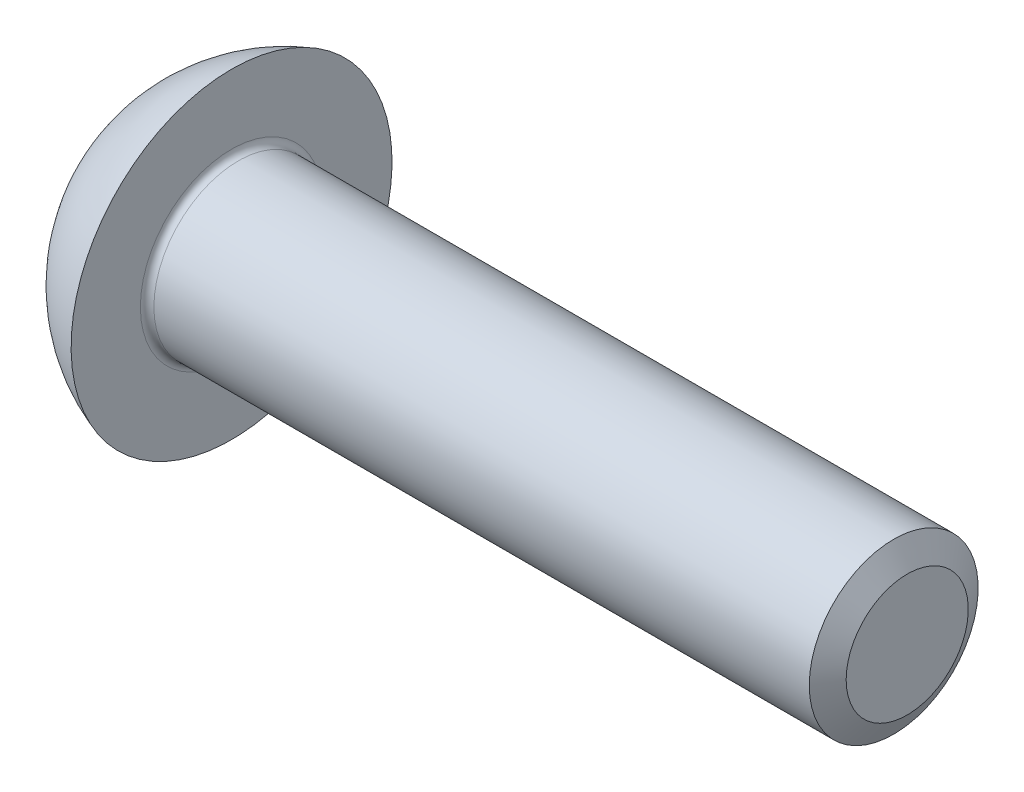
ISO-10303-21;
HEADER;
FILE_DESCRIPTION(('STEP AP214'),'2;1');
FILE_NAME('part.step','',(''),(''),'','','');
FILE_SCHEMA(('AUTOMOTIVE_DESIGN { 1 0 10303 214 1 1 1 1 }'));
ENDSEC;
DATA;
#1=APPLICATION_CONTEXT('core data for automotive mechanical design processes');
#2=APPLICATION_PROTOCOL_DEFINITION('international standard','automotive_design',2000,#1);
#3=PRODUCT_CONTEXT('',#1,'mechanical');
#4=PRODUCT('Part','Part','',(#3));
#5=PRODUCT_RELATED_PRODUCT_CATEGORY('part','',(#4));
#6=PRODUCT_DEFINITION_FORMATION('','',#4);
#7=PRODUCT_DEFINITION_CONTEXT('part definition',#1,'design');
#8=PRODUCT_DEFINITION('design','',#6,#7);
#9=PRODUCT_DEFINITION_SHAPE('','',#8);
#10=(LENGTH_UNIT() NAMED_UNIT(*) SI_UNIT(.MILLI.,.METRE.));
#11=(NAMED_UNIT(*) PLANE_ANGLE_UNIT() SI_UNIT($,.RADIAN.));
#12=(NAMED_UNIT(*) SI_UNIT($,.STERADIAN.) SOLID_ANGLE_UNIT());
#13=UNCERTAINTY_MEASURE_WITH_UNIT(LENGTH_MEASURE(1.E-05),#10,'distance_accuracy_value','');
#14=(GEOMETRIC_REPRESENTATION_CONTEXT(3) GLOBAL_UNCERTAINTY_ASSIGNED_CONTEXT((#13)) GLOBAL_UNIT_ASSIGNED_CONTEXT((#10,
#11,#12)) REPRESENTATION_CONTEXT('',''));
#15=CARTESIAN_POINT('',(0.,0.,0.));
#16=DIRECTION('',(0.,0.,1.));
#17=DIRECTION('',(1.,0.,0.));
#18=AXIS2_PLACEMENT_3D('',#15,#16,#17);
#19=CARTESIAN_POINT('',(-22.75,0.,0.));
#20=DIRECTION('',(-1.,0.,0.));
#21=DIRECTION('',(0.,0.,1.));
#22=AXIS2_PLACEMENT_3D('',#19,#20,#21);
#23=CYLINDRICAL_SURFACE('',#22,2.5);
#24=CARTESIAN_POINT('',(-19.8,0.,0.));
#25=DIRECTION('',(-1.,0.,0.));
#26=DIRECTION('',(0.,0.,1.));
#27=AXIS2_PLACEMENT_3D('',#24,#25,#26);
#28=CIRCLE('',#27,2.5);
#29=CARTESIAN_POINT('',(-19.8,0.,2.5));
#30=VERTEX_POINT('',#29);
#31=EDGE_CURVE('E258',#30,#30,#28,.T.);
#32=ORIENTED_EDGE('',*,*,#31,.F.);
#33=EDGE_LOOP('',(#32));
#34=FACE_BOUND('',#33,.T.);
#35=CARTESIAN_POINT('',(-0.4,0.,0.));
#36=DIRECTION('',(-1.,0.,0.));
#37=DIRECTION('',(0.,0.,1.));
#38=AXIS2_PLACEMENT_3D('',#35,#36,#37);
#39=CIRCLE('',#38,2.5);
#40=CARTESIAN_POINT('',(-0.4,0.,2.5));
#41=VERTEX_POINT('',#40);
#42=EDGE_CURVE('E445',#41,#41,#39,.T.);
#43=ORIENTED_EDGE('',*,*,#42,.T.);
#44=EDGE_LOOP('',(#43));
#45=FACE_BOUND('',#44,.T.);
#46=ADVANCED_FACE('F37',(#34,#45),#23,.T.);
#47=CARTESIAN_POINT('',(-22.75,0.,0.));
#48=DIRECTION('',(1.,0.,0.));
#49=DIRECTION('',(0.,0.,-1.));
#50=AXIS2_PLACEMENT_3D('',#47,#48,#49);
#51=PLANE('',#50);
#52=CARTESIAN_POINT('',(-22.75,0.,0.));
#53=DIRECTION('',(-1.,0.,0.));
#54=DIRECTION('',(0.,0.,1.));
#55=AXIS2_PLACEMENT_3D('',#52,#53,#54);
#56=CIRCLE('',#55,2.5);
#57=CARTESIAN_POINT('',(-22.75,2.5,0.));
#58=VERTEX_POINT('',#57);
#59=EDGE_CURVE('E250',#58,#58,#56,.T.);
#60=ORIENTED_EDGE('',*,*,#59,.T.);
#61=EDGE_LOOP('',(#60));
#62=FACE_BOUND('',#61,.T.);
#63=CARTESIAN_POINT('',(-22.75,0.,0.));
#64=DIRECTION('',(1.,0.,0.));
#65=DIRECTION('',(0.,0.,-1.));
#66=AXIS2_PLACEMENT_3D('',#63,#64,#65);
#67=CIRCLE('',#66,1.73205080756888);
#68=CARTESIAN_POINT('',(-22.75,-0.866025403784439,-1.5));
#69=VERTEX_POINT('',#68);
#70=CARTESIAN_POINT('',(-22.75,-1.73205080756888,0.));
#71=VERTEX_POINT('',#70);
#72=EDGE_CURVE('E11',#69,#71,#67,.F.);
#73=ORIENTED_EDGE('',*,*,#72,.F.);
#74=CARTESIAN_POINT('',(-22.75,0.866025403784439,-1.5));
#75=VERTEX_POINT('',#74);
#76=EDGE_CURVE('E41',#75,#69,#67,.F.);
#77=ORIENTED_EDGE('',*,*,#76,.F.);
#78=CARTESIAN_POINT('',(-22.75,1.73205080756888,0.));
#79=VERTEX_POINT('',#78);
#80=EDGE_CURVE('E110',#79,#75,#67,.F.);
#81=ORIENTED_EDGE('',*,*,#80,.F.);
#82=CARTESIAN_POINT('',(-22.75,0.866025403784438,1.5));
#83=VERTEX_POINT('',#82);
#84=EDGE_CURVE('E323',#83,#79,#67,.F.);
#85=ORIENTED_EDGE('',*,*,#84,.F.);
#86=CARTESIAN_POINT('',(-22.75,-0.866025403784438,1.5));
#87=VERTEX_POINT('',#86);
#88=EDGE_CURVE('E46',#87,#83,#67,.F.);
#89=ORIENTED_EDGE('',*,*,#88,.F.);
#90=CARTESIAN_POINT('',(-22.75,0.,0.));
#91=DIRECTION('',(-1.,0.,0.));
#92=DIRECTION('',(0.,-1.,0.));
#93=AXIS2_PLACEMENT_3D('',#90,#91,#92);
#94=CIRCLE('',#93,1.73205080756888);
#95=EDGE_CURVE('E113',#71,#87,#94,.T.);
#96=ORIENTED_EDGE('',*,*,#95,.F.);
#97=EDGE_LOOP('',(#73,#77,#81,#85,#89,#96));
#98=FACE_BOUND('',#97,.T.);
#99=ADVANCED_FACE('F39',(#62,#98),#51,.F.);
#100=CARTESIAN_POINT('',(-18.4090909090909,0.,0.));
#101=DIRECTION('',(-1.,0.,0.));
#102=DIRECTION('',(0.,1.,0.));
#103=AXIS2_PLACEMENT_3D('',#100,#101,#102);
#104=SPHERICAL_SURFACE('',#103,5.00934044915468);
#105=CARTESIAN_POINT('',(-20.,0.,0.));
#106=DIRECTION('',(-1.,0.,0.));
#107=DIRECTION('',(0.,0.,1.));
#108=AXIS2_PLACEMENT_3D('',#105,#106,#107);
#109=CIRCLE('',#108,4.75);
#110=CARTESIAN_POINT('',(-20.,4.75,0.));
#111=VERTEX_POINT('',#110);
#112=EDGE_CURVE('E253',#111,#111,#109,.T.);
#113=CARTESIAN_POINT('',(-22.75,2.5,0.));
#114=CARTESIAN_POINT('',(-22.7311175552492,2.53278694875913,0.));
#115=CARTESIAN_POINT('',(-22.7118635180392,2.56535988781073,0.));
#116=CARTESIAN_POINT('',(-22.6726224406993,2.6300612032684,0.));
#117=CARTESIAN_POINT('',(-22.6526354005692,2.66218957967448,0.));
#118=CARTESIAN_POINT('',(-22.6119384993871,2.72598522661067,0.));
#119=CARTESIAN_POINT('',(-22.591228638335,2.75765249714078,0.));
#120=CARTESIAN_POINT('',(-22.5490967492469,2.82050968698786,0.));
#121=CARTESIAN_POINT('',(-22.5276747212109,2.85169960630483,0.));
#122=CARTESIAN_POINT('',(-22.4841294907069,2.91358607707779,0.));
#123=CARTESIAN_POINT('',(-22.4620062882389,2.94428262853379,0.));
#124=CARTESIAN_POINT('',(-22.4170700686518,3.00516660462735,0.));
#125=CARTESIAN_POINT('',(-22.3942570515327,3.03535402926492,0.));
#126=CARTESIAN_POINT('',(-22.3479529146413,3.09520425297794,0.));
#127=CARTESIAN_POINT('',(-22.3244617948691,3.12486705205339,0.));
#128=CARTESIAN_POINT('',(-22.2768135133334,3.1836527955612,0.));
#129=CARTESIAN_POINT('',(-22.2526563515699,3.21277573999356,0.));
#130=CARTESIAN_POINT('',(-22.2036883885261,3.27046682221599,0.));
#131=CARTESIAN_POINT('',(-22.1788775872458,3.29903496000605,0.));
#132=CARTESIAN_POINT('',(-22.1286150832646,3.35560176180999,0.));
#133=CARTESIAN_POINT('',(-22.1031633805637,3.38360042582388,0.));
#134=CARTESIAN_POINT('',(-22.0516321408722,3.43901390530852,0.));
#135=CARTESIAN_POINT('',(-22.0255526038815,3.46642872077927,0.));
#136=CARTESIAN_POINT('',(-21.9727790850795,3.52066042816535,0.));
#137=CARTESIAN_POINT('',(-21.9460851032681,3.54747732008068,0.));
#138=CARTESIAN_POINT('',(-21.8920963997549,3.60049941232258,0.));
#139=CARTESIAN_POINT('',(-21.8648016780529,3.62670461264913,0.));
#140=CARTESIAN_POINT('',(-21.8096255081138,3.67848986772817,0.));
#141=CARTESIAN_POINT('',(-21.7817440598766,3.70406992248065,0.));
#142=CARTESIAN_POINT('',(-21.7254087514531,3.75459175338155,0.));
#143=CARTESIAN_POINT('',(-21.6969548912667,3.77953352952998,0.));
#144=CARTESIAN_POINT('',(-21.6394893674124,3.82876599789079,0.));
#145=CARTESIAN_POINT('',(-21.6104777037444,3.85305669010317,0.));
#146=CARTESIAN_POINT('',(-21.5519114677755,3.90097451953224,0.));
#147=CARTESIAN_POINT('',(-21.5223568954747,3.92460165674892,0.));
#148=CARTESIAN_POINT('',(-21.4627200158231,3.97118024580204,0.));
#149=CARTESIAN_POINT('',(-21.4326377084724,3.99413169763847,0.));
#150=CARTESIAN_POINT('',(-21.371960803248,4.03934713244946,0.));
#151=CARTESIAN_POINT('',(-21.3413662053744,4.06161111542403,0.));
#152=CARTESIAN_POINT('',(-21.2796804266456,4.10544018198238,0.));
#153=CARTESIAN_POINT('',(-21.2485892457905,4.12700526556617,0.));
#154=CARTESIAN_POINT('',(-21.1859262635903,4.16942546163525,0.));
#155=CARTESIAN_POINT('',(-21.1543544622453,4.19028057412053,0.));
#156=CARTESIAN_POINT('',(-21.090746448312,4.2312701207906,0.));
#157=CARTESIAN_POINT('',(-21.0587102357238,4.25140455497539,0.));
#158=CARTESIAN_POINT('',(-20.9941898469831,4.29094240784443,0.));
#159=CARTESIAN_POINT('',(-20.9617056708307,4.31034582652867,0.));
#160=CARTESIAN_POINT('',(-20.8963060326305,4.34841168650943,0.));
#161=CARTESIAN_POINT('',(-20.8633905705828,4.36707412780594,0.));
#162=CARTESIAN_POINT('',(-20.7971452596828,4.4036484515375,0.));
#163=CARTESIAN_POINT('',(-20.7638154108306,4.42156033397254,0.));
#164=CARTESIAN_POINT('',(-20.6967584381773,4.45662434389216,0.));
#165=CARTESIAN_POINT('',(-20.6630313143761,4.47377647137673,0.));
#166=CARTESIAN_POINT('',(-20.5951971075898,4.50731216521815,0.));
#167=CARTESIAN_POINT('',(-20.5610900246047,4.52369573157501,0.));
#168=CARTESIAN_POINT('',(-20.4925134104957,4.55568589214188,0.));
#169=CARTESIAN_POINT('',(-20.4580438793719,4.5712924863519,0.));
#170=CARTESIAN_POINT('',(-20.3887600653461,4.601720688376,0.));
#171=CARTESIAN_POINT('',(-20.3539457824442,4.61654229619008,0.));
#172=CARTESIAN_POINT('',(-20.2839903410915,4.64539292215819,0.));
#173=CARTESIAN_POINT('',(-20.2488491826407,4.65942194031222,0.));
#174=CARTESIAN_POINT('',(-20.1782580235286,4.68668016088954,0.));
#175=CARTESIAN_POINT('',(-20.1428080228672,4.69990936331284,0.));
#176=CARTESIAN_POINT('',(-20.0716174112126,4.72556124794158,0.));
#177=CARTESIAN_POINT('',(-20.0358768002195,4.73798393014703,0.));
#178=CARTESIAN_POINT('',(-20.,4.75,0.));
#179=B_SPLINE_CURVE_WITH_KNOTS('',3,(#113,#114,#115,#116,#117,#118,#119,#120,#121,#122,#123,
#124,#125,#126,#127,#128,#129,#130,#131,#132,#133,#134,#135,#136,#137,#138,#139,#140,#141,#142,
#143,#144,#145,#146,#147,#148,#149,#150,#151,#152,#153,#154,#155,#156,#157,#158,#159,#160,#161,
#162,#163,#164,#165,#166,#167,#168,#169,#170,#171,#172,#173,#174,#175,#176,#177,#178),
.UNSPECIFIED.,.F.,.F.,(4,2,2,2,2,2,2,2,2,2,2,2,2,2,2,2,2,2,2,2,2,2,2,2,2,2,2,2,2,2,2,2,4),(0.,
0.11350429129235,0.2270085825847,0.340512873877048,0.454017165169399,0.567521456461748,
0.681025747754096,0.794530039046447,0.908034330338794,1.02153862163114,1.13504291292349,
1.24854720421584,1.36205149550819,1.47555578680054,1.58906007809289,1.70256436938524,
1.81606866067759,1.92957295196994,2.04307724326229,2.15658153455464,2.27008582584699,
2.38359011713934,2.49709440843168,2.61059869972403,2.72410299101638,2.83760728230873,
2.95111157360108,3.06461586489343,3.17812015618578,3.29162444747813,3.40512873877048,
3.51863303006283,3.63213732135518),.UNSPECIFIED.);
#180=EDGE_CURVE('BSEAM239',#58,#111,#179,.T.);
#181=ORIENTED_EDGE('',*,*,#59,.F.);
#182=ORIENTED_EDGE('',*,*,#112,.T.);
#183=ORIENTED_EDGE('',*,*,#180,.T.);
#184=ORIENTED_EDGE('',*,*,#180,.F.);
#185=EDGE_LOOP('',(#181,#183,#182,#184));
#186=FACE_BOUND('',#185,.T.);
#187=ADVANCED_FACE('F239',(#186),#104,.T.);
#188=CARTESIAN_POINT('',(-20.,2.7,0.));
#189=DIRECTION('',(-1.,0.,0.));
#190=DIRECTION('',(0.,0.,1.));
#191=AXIS2_PLACEMENT_3D('',#188,#189,#190);
#192=PLANE('',#191);
#193=ORIENTED_EDGE('',*,*,#112,.F.);
#194=EDGE_LOOP('',(#193));
#195=FACE_BOUND('',#194,.T.);
#196=CARTESIAN_POINT('',(-20.,0.,0.));
#197=DIRECTION('',(-1.,0.,0.));
#198=DIRECTION('',(0.,0.,1.));
#199=AXIS2_PLACEMENT_3D('',#196,#197,#198);
#200=CIRCLE('',#199,2.7);
#201=CARTESIAN_POINT('',(-20.,0.,2.7));
#202=VERTEX_POINT('',#201);
#203=EDGE_CURVE('E254',#202,#202,#200,.T.);
#204=ORIENTED_EDGE('',*,*,#203,.T.);
#205=EDGE_LOOP('',(#204));
#206=FACE_BOUND('',#205,.T.);
#207=ADVANCED_FACE('F236',(#195,#206),#192,.F.);
#208=CARTESIAN_POINT('',(-19.8,0.,0.));
#209=DIRECTION('',(-1.,0.,0.));
#210=DIRECTION('',(0.,0.,1.));
#211=AXIS2_PLACEMENT_3D('',#208,#209,#210);
#212=TOROIDAL_SURFACE('',#211,2.7,0.199999999999998);
#213=ORIENTED_EDGE('',*,*,#203,.F.);
#214=EDGE_LOOP('',(#213));
#215=FACE_BOUND('',#214,.T.);
#216=ORIENTED_EDGE('',*,*,#31,.T.);
#217=EDGE_LOOP('',(#216));
#218=FACE_BOUND('',#217,.T.);
#219=ADVANCED_FACE('F233',(#215,#218),#212,.F.);
#220=CARTESIAN_POINT('',(-22.31,0.,0.));
#221=DIRECTION('',(-1.,0.,0.));
#222=DIRECTION('',(0.,-1.,0.));
#223=AXIS2_PLACEMENT_3D('',#220,#221,#222);
#224=CONICAL_SURFACE('',#223,0.,1.32202446504011);
#225=CARTESIAN_POINT('',(-22.9997327986404,-2.26315484172187,-1.5));
#226=CARTESIAN_POINT('',(-22.9853857350657,-2.19538826304415,-1.5));
#227=CARTESIAN_POINT('',(-22.9712220195062,-2.12758283804671,-1.5));
#228=CARTESIAN_POINT('',(-22.9433537036584,-1.99187493960313,-1.5));
#229=CARTESIAN_POINT('',(-22.9296491220636,-1.92397246232262,-1.5));
#230=CARTESIAN_POINT('',(-22.8893400794674,-1.71997534200334,-1.5));
#231=CARTESIAN_POINT('',(-22.8635667005034,-1.58371395303,-1.5));
#232=CARTESIAN_POINT('',(-22.8155779533991,-1.3116391722774,-1.5));
#233=CARTESIAN_POINT('',(-22.7933366422251,-1.17583044881344,-1.5));
#234=CARTESIAN_POINT('',(-22.7539239714673,-0.903481186888281,-1.5));
#235=CARTESIAN_POINT('',(-22.7367516962328,-0.766940785137058,-1.5));
#236=CARTESIAN_POINT('',(-22.709706129123,-0.491701196322739,-1.5));
#237=CARTESIAN_POINT('',(-22.6999076664801,-0.352994084625562,-1.5));
#238=CARTESIAN_POINT('',(-22.6924178089428,-0.144706433475353,-1.5));
#239=CARTESIAN_POINT('',(-22.6911221806896,-0.0752488922868268,-1.5));
#240=CARTESIAN_POINT('',(-22.6909858523407,0.0636686770369285,-1.5));
#241=CARTESIAN_POINT('',(-22.6921451546032,0.133128705174482,-1.5));
#242=CARTESIAN_POINT('',(-22.6992549405331,0.341881937640922,-1.5));
#243=CARTESIAN_POINT('',(-22.7088546722717,0.481057921169191,-1.5));
#244=CARTESIAN_POINT('',(-22.7357583960435,0.758693846093776,-1.5));
#245=CARTESIAN_POINT('',(-22.7530672903777,0.89715327506259,-1.5));
#246=CARTESIAN_POINT('',(-22.7932968062946,1.17595805857205,-1.5));
#247=CARTESIAN_POINT('',(-22.8163192995755,1.31628822780093,-1.5));
#248=CARTESIAN_POINT('',(-22.8658765091574,1.59633374824371,-1.5));
#249=CARTESIAN_POINT('',(-22.8924117291953,1.73604900830285,-1.5));
#250=CARTESIAN_POINT('',(-22.9477673387906,2.01506024311157,-1.5));
#251=CARTESIAN_POINT('',(-22.9765883427125,2.15435609462068,-1.5));
#252=CARTESIAN_POINT('',(-23.0357503424025,2.43262525968748,-1.5));
#253=CARTESIAN_POINT('',(-23.0660913684414,2.57159856676409,-1.5));
#254=CARTESIAN_POINT('',(-23.1274868354949,2.84781730595656,-1.5));
#255=CARTESIAN_POINT('',(-23.1585300832571,2.9850652362243,-1.5));
#256=CARTESIAN_POINT('',(-23.2213470846916,3.25939633410717,-1.5));
#257=CARTESIAN_POINT('',(-23.2531208531965,3.39647949831729,-1.5));
#258=CARTESIAN_POINT('',(-23.3171602523357,3.67034628769396,-1.5));
#259=CARTESIAN_POINT('',(-23.3494252041408,3.80713007192236,-1.5));
#260=CARTESIAN_POINT('',(-23.4143613419051,4.08059651515644,-1.5));
#261=CARTESIAN_POINT('',(-23.4470325145344,4.21727917732529,-1.5));
#262=CARTESIAN_POINT('',(-23.4798452974435,4.35392744466994,-1.5));
#263=B_SPLINE_CURVE_WITH_KNOTS('',3,(#225,#226,#227,#228,#229,#230,#231,#232,#233,#234,#235,
#236,#237,#238,#239,#240,#241,#242,#243,#244,#245,#246,#247,#248,#249,#250,#251,#252,#253,#254,
#255,#256,#257,#258,#259,#260,#261,#262),.UNSPECIFIED.,.F.,.F.,(4,2,2,2,2,2,2,2,2,2,2,2,2,2,2,2,
2,2,4),(0.,0.207805451429304,0.415619353325522,0.831624344388975,1.24441629689243,
1.65713363858961,2.07398475112845,2.2823533704914,2.49072219003518,2.90892839515078,
3.32740092054575,3.75395104515455,4.18056240487915,4.60728881874959,5.03402373410525,
5.45616570257761,5.87831624988613,6.29992851638619,6.72152698404949),.UNSPECIFIED.);
#264=EDGE_CURVE('E101',#69,#75,#263,.T.);
#265=ORIENTED_EDGE('',*,*,#264,.T.);
#266=ORIENTED_EDGE('',*,*,#76,.T.);
#267=EDGE_LOOP('',(#265,#266));
#268=FACE_BOUND('',#267,.T.);
#269=ADVANCED_FACE('F105',(#268),#224,.F.);
#270=CARTESIAN_POINT('',(-22.7500293362665,0.865909933730601,-1.5002));
#271=CARTESIAN_POINT('',(-22.74088246153,0.901895428599615,-1.43787129455136));
#272=CARTESIAN_POINT('',(-22.7325805371761,0.937939683086652,-1.37544081445887));
#273=CARTESIAN_POINT('',(-22.7179971360444,1.01014267536443,-1.25038156337525));
#274=CARTESIAN_POINT('',(-22.7117163935223,1.04630144995174,-1.18775272865061));
#275=CARTESIAN_POINT('',(-22.7015367196182,1.11853617159982,-1.06263852068553));
#276=CARTESIAN_POINT('',(-22.6976268615435,1.15461172337414,-1.00015383210133));
#277=CARTESIAN_POINT('',(-22.6923843134507,1.22680422415262,-0.875112752827542));
#278=CARTESIAN_POINT('',(-22.6910511776652,1.26292116491464,-0.812556376413771));
#279=CARTESIAN_POINT('',(-22.6910511776652,1.33515504643868,-0.687443623586229));
#280=CARTESIAN_POINT('',(-22.6923843134507,1.37127198720069,-0.624887247172458));
#281=CARTESIAN_POINT('',(-22.6976268615435,1.44346448797918,-0.499846167898674));
#282=CARTESIAN_POINT('',(-22.7015367196182,1.47954003975349,-0.437361479314472));
#283=CARTESIAN_POINT('',(-22.7117163935223,1.55177476140158,-0.312247271349392));
#284=CARTESIAN_POINT('',(-22.7179971360444,1.58793353598888,-0.249618436624752));
#285=CARTESIAN_POINT('',(-22.7325805371761,1.66013652826666,-0.124559185541132));
#286=CARTESIAN_POINT('',(-22.74088246153,1.6961807827537,-0.0621287054486423));
#287=CARTESIAN_POINT('',(-22.7500293362665,1.73216627762271,0.000199999999999426));
#288=B_SPLINE_CURVE_WITH_KNOTS('',3,(#270,#271,#272,#273,#274,#275,#276,#277,#278,#279,#280,
#281,#282,#283,#284,#285,#286,#287),.UNSPECIFIED.,.F.,.F.,(4,2,2,2,2,2,2,2,4),(0.,
0.217659888175594,0.435398758882079,0.652126354970008,0.868816454295957,1.08550655362191,
1.30223414970984,1.51997302041632,1.73763290859191),.UNSPECIFIED.);
#289=EDGE_CURVE('E129',#75,#79,#288,.T.);
#290=ORIENTED_EDGE('',*,*,#289,.T.);
#291=ORIENTED_EDGE('',*,*,#80,.T.);
#292=EDGE_LOOP('',(#290,#291));
#293=FACE_BOUND('',#292,.T.);
#294=ADVANCED_FACE('F157',(#293),#224,.F.);
#295=CARTESIAN_POINT('',(-22.7500293362665,1.73216627762271,-0.000200000000000225));
#296=CARTESIAN_POINT('',(-22.74088246153,1.6961807827537,0.0621287054486416));
#297=CARTESIAN_POINT('',(-22.7325805371761,1.66013652826666,0.124559185541131));
#298=CARTESIAN_POINT('',(-22.7179971360444,1.58793353598888,0.249618436624751));
#299=CARTESIAN_POINT('',(-22.7117163935223,1.55177476140158,0.312247271349392));
#300=CARTESIAN_POINT('',(-22.7015367196182,1.47954003975349,0.437361479314471));
#301=CARTESIAN_POINT('',(-22.6976268615435,1.44346448797918,0.499846167898673));
#302=CARTESIAN_POINT('',(-22.6923843134507,1.37127198720069,0.624887247172458));
#303=CARTESIAN_POINT('',(-22.6910511776652,1.33515504643868,0.687443623586229));
#304=CARTESIAN_POINT('',(-22.6910511776652,1.26292116491464,0.81255637641377));
#305=CARTESIAN_POINT('',(-22.6923843134507,1.22680422415262,0.875112752827541));
#306=CARTESIAN_POINT('',(-22.6976268615435,1.15461172337414,1.00015383210133));
#307=CARTESIAN_POINT('',(-22.7015367196182,1.11853617159982,1.06263852068553));
#308=CARTESIAN_POINT('',(-22.7117163935223,1.04630144995174,1.18775272865061));
#309=CARTESIAN_POINT('',(-22.7179971360444,1.01014267536443,1.25038156337525));
#310=CARTESIAN_POINT('',(-22.7325805371761,0.937939683086651,1.37544081445887));
#311=CARTESIAN_POINT('',(-22.74088246153,0.901895428599615,1.43787129455136));
#312=CARTESIAN_POINT('',(-22.7500293362665,0.865909933730601,1.5002));
#313=B_SPLINE_CURVE_WITH_KNOTS('',3,(#295,#296,#297,#298,#299,#300,#301,#302,#303,#304,#305,
#306,#307,#308,#309,#310,#311,#312),.UNSPECIFIED.,.F.,.F.,(4,2,2,2,2,2,2,2,4),(0.,
0.217659888175594,0.435398758882078,0.652126354970008,0.868816454295957,1.08550655362191,
1.30223414970984,1.51997302041632,1.73763290859191),.UNSPECIFIED.);
#314=EDGE_CURVE('E179',#79,#83,#313,.T.);
#315=ORIENTED_EDGE('',*,*,#314,.T.);
#316=ORIENTED_EDGE('',*,*,#84,.T.);
#317=EDGE_LOOP('',(#315,#316));
#318=FACE_BOUND('',#317,.T.);
#319=ADVANCED_FACE('F151',(#318),#224,.F.);
#320=CARTESIAN_POINT('',(-22.9997327986404,-2.26315484172187,1.5));
#321=CARTESIAN_POINT('',(-22.9853857350657,-2.19538826304415,1.5));
#322=CARTESIAN_POINT('',(-22.9712220195062,-2.12758283804671,1.5));
#323=CARTESIAN_POINT('',(-22.9433537036584,-1.99187493960313,1.5));
#324=CARTESIAN_POINT('',(-22.9296491220636,-1.92397246232262,1.5));
#325=CARTESIAN_POINT('',(-22.8893400794674,-1.71997534200334,1.5));
#326=CARTESIAN_POINT('',(-22.8635667005034,-1.58371395303,1.5));
#327=CARTESIAN_POINT('',(-22.8155779533991,-1.3116391722774,1.5));
#328=CARTESIAN_POINT('',(-22.7933366422251,-1.17583044881344,1.5));
#329=CARTESIAN_POINT('',(-22.7539239714673,-0.903481186888281,1.5));
#330=CARTESIAN_POINT('',(-22.7367516962328,-0.766940785137059,1.5));
#331=CARTESIAN_POINT('',(-22.709706129123,-0.49170119632274,1.5));
#332=CARTESIAN_POINT('',(-22.6999076664801,-0.352994084625563,1.5));
#333=CARTESIAN_POINT('',(-22.6924178089428,-0.144706433475354,1.5));
#334=CARTESIAN_POINT('',(-22.6911221806896,-0.0752488922868278,1.5));
#335=CARTESIAN_POINT('',(-22.6909858523407,0.0636686770369274,1.5));
#336=CARTESIAN_POINT('',(-22.6921451546032,0.133128705174481,1.5));
#337=CARTESIAN_POINT('',(-22.6992549405331,0.341881937640921,1.5));
#338=CARTESIAN_POINT('',(-22.7088546722717,0.48105792116919,1.5));
#339=CARTESIAN_POINT('',(-22.7357583960435,0.758693846093775,1.5));
#340=CARTESIAN_POINT('',(-22.7530672903777,0.89715327506259,1.5));
#341=CARTESIAN_POINT('',(-22.7932968062946,1.17595805857205,1.5));
#342=CARTESIAN_POINT('',(-22.8163192995755,1.31628822780093,1.5));
#343=CARTESIAN_POINT('',(-22.8658765091574,1.59633374824371,1.5));
#344=CARTESIAN_POINT('',(-22.8924117291953,1.73604900830285,1.5));
#345=CARTESIAN_POINT('',(-22.9477673387906,2.01506024311157,1.5));
#346=CARTESIAN_POINT('',(-22.9765883427125,2.15435609462068,1.5));
#347=CARTESIAN_POINT('',(-23.0357503424025,2.43262525968747,1.5));
#348=CARTESIAN_POINT('',(-23.0660913684414,2.57159856676409,1.5));
#349=CARTESIAN_POINT('',(-23.1274868354949,2.84781730595656,1.5));
#350=CARTESIAN_POINT('',(-23.1585300832572,2.9850652362243,1.5));
#351=CARTESIAN_POINT('',(-23.2213470846916,3.25939633410717,1.5));
#352=CARTESIAN_POINT('',(-23.2531208531965,3.39647949831729,1.5));
#353=CARTESIAN_POINT('',(-23.3171602523357,3.67034628769396,1.5));
#354=CARTESIAN_POINT('',(-23.3494252041408,3.80713007192236,1.5));
#355=CARTESIAN_POINT('',(-23.4143613419051,4.08059651515644,1.5));
#356=CARTESIAN_POINT('',(-23.4470325145344,4.21727917732529,1.5));
#357=CARTESIAN_POINT('',(-23.4798452974435,4.35392744466993,1.5));
#358=B_SPLINE_CURVE_WITH_KNOTS('',3,(#320,#321,#322,#323,#324,#325,#326,#327,#328,#329,#330,
#331,#332,#333,#334,#335,#336,#337,#338,#339,#340,#341,#342,#343,#344,#345,#346,#347,#348,#349,
#350,#351,#352,#353,#354,#355,#356,#357),.UNSPECIFIED.,.F.,.F.,(4,2,2,2,2,2,2,2,2,2,2,2,2,2,2,2,
2,2,4),(0.,0.207805451429304,0.415619353325522,0.831624344388974,1.24441629689243,
1.65713363858961,2.07398475112845,2.2823533704914,2.49072219003518,2.90892839515078,
3.32740092054575,3.75395104515455,4.18056240487915,4.60728881874959,5.03402373410525,
5.4561657025776,5.87831624988613,6.29992851638619,6.72152698404949),.UNSPECIFIED.);
#359=EDGE_CURVE('E58',#83,#87,#358,.F.);
#360=ORIENTED_EDGE('',*,*,#359,.T.);
#361=ORIENTED_EDGE('',*,*,#88,.T.);
#362=EDGE_LOOP('',(#360,#361));
#363=FACE_BOUND('',#362,.T.);
#364=ADVANCED_FACE('F156',(#363),#224,.F.);
#365=CARTESIAN_POINT('',(-22.7500293362665,-0.865909933730602,1.5002));
#366=CARTESIAN_POINT('',(-22.74088246153,-0.901895428599616,1.43787129455136));
#367=CARTESIAN_POINT('',(-22.7325805371761,-0.937939683086652,1.37544081445887));
#368=CARTESIAN_POINT('',(-22.7179971360444,-1.01014267536443,1.25038156337525));
#369=CARTESIAN_POINT('',(-22.7117163935223,-1.04630144995174,1.18775272865061));
#370=CARTESIAN_POINT('',(-22.7015367196182,-1.11853617159982,1.06263852068553));
#371=CARTESIAN_POINT('',(-22.6976268615435,-1.15461172337414,1.00015383210133));
#372=CARTESIAN_POINT('',(-22.6923843134507,-1.22680422415262,0.875112752827541));
#373=CARTESIAN_POINT('',(-22.6910511776652,-1.26292116491464,0.81255637641377));
#374=CARTESIAN_POINT('',(-22.6910511776652,-1.33515504643868,0.687443623586229));
#375=CARTESIAN_POINT('',(-22.6923843134507,-1.3712719872007,0.624887247172458));
#376=CARTESIAN_POINT('',(-22.6976268615435,-1.44346448797918,0.499846167898673));
#377=CARTESIAN_POINT('',(-22.7015367196182,-1.4795400397535,0.437361479314471));
#378=CARTESIAN_POINT('',(-22.7117163935223,-1.55177476140158,0.312247271349391));
#379=CARTESIAN_POINT('',(-22.7179971360444,-1.58793353598888,0.249618436624751));
#380=CARTESIAN_POINT('',(-22.7325805371761,-1.66013652826667,0.12455918554113));
#381=CARTESIAN_POINT('',(-22.74088246153,-1.6961807827537,0.0621287054486408));
#382=CARTESIAN_POINT('',(-22.7500293362665,-1.73216627762272,-0.000200000000000785));
#383=B_SPLINE_CURVE_WITH_KNOTS('',3,(#365,#366,#367,#368,#369,#370,#371,#372,#373,#374,#375,
#376,#377,#378,#379,#380,#381,#382),.UNSPECIFIED.,.F.,.F.,(4,2,2,2,2,2,2,2,4),(0.,
0.217659888175594,0.435398758882079,0.652126354970009,0.868816454295957,1.08550655362191,
1.30223414970984,1.51997302041632,1.73763290859191),.UNSPECIFIED.);
#384=EDGE_CURVE('E52',#87,#71,#383,.T.);
#385=ORIENTED_EDGE('',*,*,#384,.T.);
#386=ORIENTED_EDGE('',*,*,#95,.T.);
#387=EDGE_LOOP('',(#385,#386));
#388=FACE_BOUND('',#387,.T.);
#389=ADVANCED_FACE('F310',(#388),#224,.F.);
#390=CARTESIAN_POINT('',(-22.7500293362665,-1.73216627762272,0.00019999999999925));
#391=CARTESIAN_POINT('',(-22.74088246153,-1.6961807827537,-0.0621287054486427));
#392=CARTESIAN_POINT('',(-22.7325805371761,-1.66013652826667,-0.124559185541132));
#393=CARTESIAN_POINT('',(-22.7179971360444,-1.58793353598888,-0.249618436624752));
#394=CARTESIAN_POINT('',(-22.7117163935223,-1.55177476140158,-0.312247271349392));
#395=CARTESIAN_POINT('',(-22.7015367196182,-1.4795400397535,-0.437361479314472));
#396=CARTESIAN_POINT('',(-22.6976268615435,-1.44346448797918,-0.499846167898674));
#397=CARTESIAN_POINT('',(-22.6923843134507,-1.3712719872007,-0.624887247172459));
#398=CARTESIAN_POINT('',(-22.6910511776652,-1.33515504643868,-0.687443623586229));
#399=CARTESIAN_POINT('',(-22.6910511776652,-1.26292116491464,-0.812556376413771));
#400=CARTESIAN_POINT('',(-22.6923843134507,-1.22680422415262,-0.875112752827542));
#401=CARTESIAN_POINT('',(-22.6976268615435,-1.15461172337414,-1.00015383210133));
#402=CARTESIAN_POINT('',(-22.7015367196182,-1.11853617159982,-1.06263852068553));
#403=CARTESIAN_POINT('',(-22.7117163935223,-1.04630144995174,-1.18775272865061));
#404=CARTESIAN_POINT('',(-22.7179971360444,-1.01014267536443,-1.25038156337525));
#405=CARTESIAN_POINT('',(-22.7325805371761,-0.937939683086652,-1.37544081445887));
#406=CARTESIAN_POINT('',(-22.74088246153,-0.901895428599616,-1.43787129455136));
#407=CARTESIAN_POINT('',(-22.7500293362665,-0.865909933730602,-1.5002));
#408=B_SPLINE_CURVE_WITH_KNOTS('',3,(#390,#391,#392,#393,#394,#395,#396,#397,#398,#399,#400,
#401,#402,#403,#404,#405,#406,#407),.UNSPECIFIED.,.F.,.F.,(4,2,2,2,2,2,2,2,4),(0.,
0.217659888175594,0.435398758882078,0.652126354970008,0.868816454295957,1.08550655362191,
1.30223414970984,1.51997302041632,1.73763290859191),.UNSPECIFIED.);
#409=EDGE_CURVE('E93',#71,#69,#408,.T.);
#410=ORIENTED_EDGE('',*,*,#409,.T.);
#411=ORIENTED_EDGE('',*,*,#72,.T.);
#412=EDGE_LOOP('',(#410,#411));
#413=FACE_BOUND('',#412,.T.);
#414=ADVANCED_FACE('F95',(#413),#224,.F.);
#415=CARTESIAN_POINT('',(-21.19,0.,0.));
#416=DIRECTION('',(-1.,0.,0.));
#417=DIRECTION('',(0.,0.,1.));
#418=AXIS2_PLACEMENT_3D('',#415,#416,#417);
#419=CONICAL_SURFACE('',#418,1.73205080756888,0.968816775195701);
#420=CARTESIAN_POINT('',(-20.,0.,0.));
#421=VERTEX_POINT('',#420);
#422=VERTEX_LOOP('',#421);
#423=FACE_BOUND('',#422,.T.);
#424=CARTESIAN_POINT('',(-21.7143652871569,-1.99408064313991,1.5));
#425=CARTESIAN_POINT('',(-21.684227855331,-1.93917647330948,1.5));
#426=CARTESIAN_POINT('',(-21.6544233144778,-1.88408663074089,1.5));
#427=CARTESIAN_POINT('',(-21.5956475088077,-1.77344983083036,1.5));
#428=CARTESIAN_POINT('',(-21.5666764212646,-1.71790277942533,1.5));
#429=CARTESIAN_POINT('',(-21.509567028683,-1.60593431975272,1.5));
#430=CARTESIAN_POINT('',(-21.4814351847783,-1.54950959844382,1.5));
#431=CARTESIAN_POINT('',(-21.4264488202439,-1.43604611919069,1.5));
#432=CARTESIAN_POINT('',(-21.399594226521,-1.37900739661351,1.5));
#433=CARTESIAN_POINT('',(-21.3197775837943,-1.2033156155846,1.5));
#434=CARTESIAN_POINT('',(-21.2693416399369,-1.08349045754164,1.5));
#435=CARTESIAN_POINT('',(-21.1790949619613,-0.840058194478799,1.5));
#436=CARTESIAN_POINT('',(-21.139256444983,-0.716461944664996,1.5));
#437=CARTESIAN_POINT('',(-21.0902439408571,-0.521743313216657,1.5));
#438=CARTESIAN_POINT('',(-21.0753421174822,-0.452079932693849,1.5));
#439=CARTESIAN_POINT('',(-21.0515518141556,-0.311717383105092,1.5));
#440=CARTESIAN_POINT('',(-21.0426622801891,-0.241018397812502,1.5));
#441=CARTESIAN_POINT('',(-21.0317604291189,-0.100110996787739,1.5));
#442=CARTESIAN_POINT('',(-21.0296501098018,-0.0299103680159279,1.5));
#443=CARTESIAN_POINT('',(-21.0322315011996,0.110369362468128,1.5));
#444=CARTESIAN_POINT('',(-21.0369241805432,0.180448445451889,1.5));
#445=CARTESIAN_POINT('',(-21.0544804827323,0.335771456747225,1.5));
#446=CARTESIAN_POINT('',(-21.0689629761538,0.42083042497674,1.5));
#447=CARTESIAN_POINT('',(-21.1058580296261,0.589196026048483,1.5));
#448=CARTESIAN_POINT('',(-21.1282753745263,0.672501569361895,1.5));
#449=CARTESIAN_POINT('',(-21.1797644805511,0.839227656420883,1.5));
#450=CARTESIAN_POINT('',(-21.208985606932,0.922601164698551,1.5));
#451=CARTESIAN_POINT('',(-21.2562928043733,1.04629218365327,1.5));
#452=CARTESIAN_POINT('',(-21.272640267702,1.0872924127348,1.5));
#453=CARTESIAN_POINT('',(-21.3063320836918,1.16888024651752,1.5));
#454=CARTESIAN_POINT('',(-21.3236763971299,1.20946786737972,1.5));
#455=CARTESIAN_POINT('',(-21.3779952738762,1.33298038355505,1.5));
#456=CARTESIAN_POINT('',(-21.4163386174147,1.41530297926867,1.5));
#457=CARTESIAN_POINT('',(-21.495635756582,1.57868674687711,1.5));
#458=CARTESIAN_POINT('',(-21.5365900776787,1.65974766074443,1.5));
#459=CARTESIAN_POINT('',(-21.6204609314907,1.82090931341637,1.5));
#460=CARTESIAN_POINT('',(-21.6633786931538,1.90100941012621,1.5));
#461=CARTESIAN_POINT('',(-21.7506848855457,2.06040592965211,1.5));
#462=CARTESIAN_POINT('',(-21.7950733934288,2.13970231002002,1.5));
#463=CARTESIAN_POINT('',(-21.930164519251,2.37707005979971,1.5));
#464=CARTESIAN_POINT('',(-22.0225574046205,2.53417780353515,1.5));
#465=CARTESIAN_POINT('',(-22.2100828976953,2.84665345203122,1.5));
#466=CARTESIAN_POINT('',(-22.3052144606998,3.00202198962762,1.5));
#467=CARTESIAN_POINT('',(-22.4847567141849,3.29134301760585,1.5));
#468=CARTESIAN_POINT('',(-22.5689406054582,3.42543652219581,1.5));
#469=CARTESIAN_POINT('',(-22.7383361071422,3.69299221027437,1.5));
#470=CARTESIAN_POINT('',(-22.8235478291718,3.82645432296446,1.5));
#471=CARTESIAN_POINT('',(-22.9942515824776,4.09214637193531,1.5));
#472=CARTESIAN_POINT('',(-23.0797393883462,4.22437902653419,1.5));
#473=CARTESIAN_POINT('',(-23.2512890449572,4.4884464344062,1.5));
#474=CARTESIAN_POINT('',(-23.337350817286,4.62028123859731,1.5));
#475=CARTESIAN_POINT('',(-23.4236230682157,4.75197710942023,1.5));
#476=B_SPLINE_CURVE_WITH_KNOTS('',3,(#424,#425,#426,#427,#428,#429,#430,#431,#432,#433,#434,
#435,#436,#437,#438,#439,#440,#441,#442,#443,#444,#445,#446,#447,#448,#449,#450,#451,#452,#453,
#454,#455,#456,#457,#458,#459,#460,#461,#462,#463,#464,#465,#466,#467,#468,#469,#470,#471,#472,
#473,#474,#475),.UNSPECIFIED.,.F.,.F.,(4,2,2,2,2,2,2,2,2,2,2,2,2,2,2,2,2,2,2,2,2,2,2,2,2,4),(0.,
0.187897672724947,0.375835019809248,0.564966516875887,0.754087177468068,1.14383628374048,
1.53255329837711,1.74605704440217,1.95952335136655,2.1698895080779,2.38028562021646,
2.63864645394486,2.89716334978483,3.16200405007932,3.29441189873304,3.42681454110393,
3.69918602540153,3.97161249945486,4.24421188688914,4.51682559737459,5.06355522456946,
5.61007898891364,6.08505893344604,6.56009093214661,7.03246913033172,7.50478406427736),.UNSPECIFIED.);
#477=CARTESIAN_POINT('',(-21.19,-0.86602540378444,1.5));
#478=VERTEX_POINT('',#477);
#479=CARTESIAN_POINT('',(-21.19,0.866025403784438,1.5));
#480=VERTEX_POINT('',#479);
#481=EDGE_CURVE('E195',#478,#480,#476,.T.);
#482=ORIENTED_EDGE('',*,*,#481,.T.);
#483=CARTESIAN_POINT('',(-21.1900793412661,0.865909933730601,1.5002));
#484=CARTESIAN_POINT('',(-21.1634691060164,0.904628108595007,1.43313815395851));
#485=CARTESIAN_POINT('',(-21.1392096198792,0.943819339495373,1.36525695082791));
#486=CARTESIAN_POINT('',(-21.0969184478749,1.02317811595438,1.2278035179744));
#487=CARTESIAN_POINT('',(-21.0789101024377,1.06334873364809,1.15822596715748));
#488=CARTESIAN_POINT('',(-21.051360884505,1.14298393177099,1.02029375793781));
#489=CARTESIAN_POINT('',(-21.0415446088461,1.18242369147111,0.951982090298889));
#490=CARTESIAN_POINT('',(-21.0304461987689,1.2615373932253,0.814953139285775));
#491=CARTESIAN_POINT('',(-21.0291476300534,1.30121073639966,0.746236893201675));
#492=CARTESIAN_POINT('',(-21.034672374901,1.37365810646578,0.62075436737241));
#493=CARTESIAN_POINT('',(-21.0401544132113,1.40646009894811,0.563939649803516));
#494=CARTESIAN_POINT('',(-21.0566235391784,1.47175617463545,0.450843529178185));
#495=CARTESIAN_POINT('',(-21.0676180560889,1.50424978184483,0.394562950570362));
#496=CARTESIAN_POINT('',(-21.0947645558192,1.56971224903147,0.281178631414286));
#497=CARTESIAN_POINT('',(-21.1110632959916,1.6026654835586,0.224101954939563));
#498=CARTESIAN_POINT('',(-21.1477413089342,1.66790213243921,0.111108764562817));
#499=CARTESIAN_POINT('',(-21.1681087683375,1.70018719405561,0.0551893975177129));
#500=CARTESIAN_POINT('',(-21.1900793412661,1.73216627762271,-0.0001999999999999));
#501=B_SPLINE_CURVE_WITH_KNOTS('',3,(#483,#484,#485,#486,#487,#488,#489,#490,#491,#492,#493,
#494,#495,#496,#497,#498,#499,#500),.UNSPECIFIED.,.F.,.F.,(4,2,2,2,2,2,2,2,4),(0.,
0.245805375632314,0.49251890592962,0.730559729160707,0.968141134459948,1.16539297017391,
1.36291136273929,1.56644008251059,1.76938623584072),.UNSPECIFIED.);
#502=CARTESIAN_POINT('',(-21.19,1.73205080756888,0.));
#503=VERTEX_POINT('',#502);
#504=EDGE_CURVE('E203',#480,#503,#501,.T.);
#505=ORIENTED_EDGE('',*,*,#504,.T.);
#506=CARTESIAN_POINT('',(-21.1900793412661,1.73216627762271,0.000199999999999483));
#507=CARTESIAN_POINT('',(-21.1634691060164,1.69344810275831,-0.0668618460414885));
#508=CARTESIAN_POINT('',(-21.1392096198792,1.65425687185794,-0.134743049172086));
#509=CARTESIAN_POINT('',(-21.0969184478749,1.57489809539893,-0.272196482025596));
#510=CARTESIAN_POINT('',(-21.0789101024377,1.53472747770523,-0.341774032842517));
#511=CARTESIAN_POINT('',(-21.051360884505,1.45509227958233,-0.479706242062188));
#512=CARTESIAN_POINT('',(-21.0415446088461,1.4156525198822,-0.548017909701111));
#513=CARTESIAN_POINT('',(-21.0304461987689,1.33653881812801,-0.685046860714224));
#514=CARTESIAN_POINT('',(-21.0291476300534,1.29686547495366,-0.753763106798324));
#515=CARTESIAN_POINT('',(-21.034672374901,1.22441810488754,-0.87924563262759));
#516=CARTESIAN_POINT('',(-21.0401544132113,1.1916161124052,-0.936060350196484));
#517=CARTESIAN_POINT('',(-21.0566235391784,1.12632003671786,-1.04915647082182));
#518=CARTESIAN_POINT('',(-21.0676180560889,1.09382642950849,-1.10543704942964));
#519=CARTESIAN_POINT('',(-21.0947645558192,1.02836396232185,-1.21882136858571));
#520=CARTESIAN_POINT('',(-21.1110632959916,0.995410727794717,-1.27589804506044));
#521=CARTESIAN_POINT('',(-21.1477413089342,0.930174078914108,-1.38889123543718));
#522=CARTESIAN_POINT('',(-21.1681087683375,0.897889017297704,-1.44481060248229));
#523=CARTESIAN_POINT('',(-21.1900793412661,0.865909933730601,-1.5002));
#524=B_SPLINE_CURVE_WITH_KNOTS('',3,(#506,#507,#508,#509,#510,#511,#512,#513,#514,#515,#516,
#517,#518,#519,#520,#521,#522,#523),.UNSPECIFIED.,.F.,.F.,(4,2,2,2,2,2,2,2,4),(0.,
0.245805375632315,0.49251890592962,0.730559729160706,0.968141134459948,1.16539297017391,
1.36291136273929,1.56644008251059,1.76938623584072),.UNSPECIFIED.);
#525=CARTESIAN_POINT('',(-21.19,0.86602540378444,-1.5));
#526=VERTEX_POINT('',#525);
#527=EDGE_CURVE('E111',#503,#526,#524,.T.);
#528=ORIENTED_EDGE('',*,*,#527,.T.);
#529=CARTESIAN_POINT('',(-21.7143652871569,-1.99408064313991,-1.5));
#530=CARTESIAN_POINT('',(-21.684227855331,-1.93917647330948,-1.5));
#531=CARTESIAN_POINT('',(-21.6544233144778,-1.88408663074089,-1.5));
#532=CARTESIAN_POINT('',(-21.5956475088077,-1.77344983083036,-1.5));
#533=CARTESIAN_POINT('',(-21.5666764212646,-1.71790277942533,-1.5));
#534=CARTESIAN_POINT('',(-21.509567028683,-1.60593431975273,-1.5));
#535=CARTESIAN_POINT('',(-21.4814351847783,-1.54950959844382,-1.5));
#536=CARTESIAN_POINT('',(-21.4264488202439,-1.43604611919069,-1.5));
#537=CARTESIAN_POINT('',(-21.399594226521,-1.37900739661351,-1.5));
#538=CARTESIAN_POINT('',(-21.3197775837943,-1.2033156155846,-1.5));
#539=CARTESIAN_POINT('',(-21.2693416399369,-1.08349045754164,-1.5));
#540=CARTESIAN_POINT('',(-21.1790949619613,-0.840058194478798,-1.5));
#541=CARTESIAN_POINT('',(-21.139256444983,-0.716461944664996,-1.5));
#542=CARTESIAN_POINT('',(-21.0902439408571,-0.521743313216657,-1.5));
#543=CARTESIAN_POINT('',(-21.0753421174822,-0.452079932693849,-1.5));
#544=CARTESIAN_POINT('',(-21.0515518141556,-0.311717383105092,-1.5));
#545=CARTESIAN_POINT('',(-21.0426622801891,-0.241018397812501,-1.5));
#546=CARTESIAN_POINT('',(-21.0317604291189,-0.100110996787739,-1.5));
#547=CARTESIAN_POINT('',(-21.0296501098018,-0.0299103680159278,-1.5));
#548=CARTESIAN_POINT('',(-21.0322315011996,0.110369362468128,-1.5));
#549=CARTESIAN_POINT('',(-21.0369241805432,0.180448445451889,-1.5));
#550=CARTESIAN_POINT('',(-21.0544804827323,0.335771456747225,-1.5));
#551=CARTESIAN_POINT('',(-21.0689629761538,0.42083042497674,-1.5));
#552=CARTESIAN_POINT('',(-21.1058580296261,0.589196026048482,-1.5));
#553=CARTESIAN_POINT('',(-21.1282753745263,0.672501569361895,-1.5));
#554=CARTESIAN_POINT('',(-21.1797644805511,0.839227656420883,-1.5));
#555=CARTESIAN_POINT('',(-21.208985606932,0.922601164698551,-1.5));
#556=CARTESIAN_POINT('',(-21.2562928043733,1.04629218365327,-1.5));
#557=CARTESIAN_POINT('',(-21.272640267702,1.0872924127348,-1.5));
#558=CARTESIAN_POINT('',(-21.3063320836918,1.16888024651752,-1.5));
#559=CARTESIAN_POINT('',(-21.3236763971299,1.20946786737972,-1.5));
#560=CARTESIAN_POINT('',(-21.3779952738762,1.33298038355505,-1.5));
#561=CARTESIAN_POINT('',(-21.4163386174147,1.41530297926867,-1.5));
#562=CARTESIAN_POINT('',(-21.495635756582,1.57868674687711,-1.5));
#563=CARTESIAN_POINT('',(-21.5365900776787,1.65974766074443,-1.5));
#564=CARTESIAN_POINT('',(-21.6204609314907,1.82090931341638,-1.5));
#565=CARTESIAN_POINT('',(-21.6633786931538,1.90100941012621,-1.5));
#566=CARTESIAN_POINT('',(-21.7506848855457,2.06040592965211,-1.5));
#567=CARTESIAN_POINT('',(-21.7950733934288,2.13970231002002,-1.5));
#568=CARTESIAN_POINT('',(-21.930164519251,2.37707005979971,-1.5));
#569=CARTESIAN_POINT('',(-22.0225574046205,2.53417780353515,-1.5));
#570=CARTESIAN_POINT('',(-22.2100828976953,2.84665345203122,-1.5));
#571=CARTESIAN_POINT('',(-22.3052144606998,3.00202198962762,-1.5));
#572=CARTESIAN_POINT('',(-22.4847567141849,3.29134301760585,-1.5));
#573=CARTESIAN_POINT('',(-22.5689406054582,3.42543652219581,-1.5));
#574=CARTESIAN_POINT('',(-22.7383361071422,3.69299221027437,-1.5));
#575=CARTESIAN_POINT('',(-22.8235478291718,3.82645432296446,-1.5));
#576=CARTESIAN_POINT('',(-22.9942515824776,4.09214637193531,-1.5));
#577=CARTESIAN_POINT('',(-23.0797393883462,4.22437902653419,-1.5));
#578=CARTESIAN_POINT('',(-23.2512890449572,4.4884464344062,-1.5));
#579=CARTESIAN_POINT('',(-23.337350817286,4.62028123859731,-1.5));
#580=CARTESIAN_POINT('',(-23.4236230682157,4.75197710942023,-1.5));
#581=B_SPLINE_CURVE_WITH_KNOTS('',3,(#529,#530,#531,#532,#533,#534,#535,#536,#537,#538,#539,
#540,#541,#542,#543,#544,#545,#546,#547,#548,#549,#550,#551,#552,#553,#554,#555,#556,#557,#558,
#559,#560,#561,#562,#563,#564,#565,#566,#567,#568,#569,#570,#571,#572,#573,#574,#575,#576,#577,
#578,#579,#580),.UNSPECIFIED.,.F.,.F.,(4,2,2,2,2,2,2,2,2,2,2,2,2,2,2,2,2,2,2,2,2,2,2,2,2,4),(0.,
0.187897672724947,0.375835019809247,0.564966516875886,0.754087177468068,1.14383628374049,
1.53255329837711,1.74605704440217,1.95952335136655,2.1698895080779,2.38028562021646,
2.63864645394486,2.89716334978483,3.16200405007932,3.29441189873304,3.42681454110393,
3.69918602540153,3.97161249945487,4.24421188688914,4.51682559737459,5.06355522456946,
5.61007898891364,6.08505893344604,6.56009093214661,7.03246913033172,7.50478406427736),.UNSPECIFIED.);
#582=CARTESIAN_POINT('',(-21.19,-0.866025403784439,-1.5));
#583=VERTEX_POINT('',#582);
#584=EDGE_CURVE('E267',#526,#583,#581,.F.);
#585=ORIENTED_EDGE('',*,*,#584,.T.);
#586=CARTESIAN_POINT('',(-21.1900793412661,-0.865909933730602,-1.5002));
#587=CARTESIAN_POINT('',(-21.1634691060164,-0.904628108595008,-1.43313815395851));
#588=CARTESIAN_POINT('',(-21.1392096198792,-0.943819339495374,-1.36525695082791));
#589=CARTESIAN_POINT('',(-21.0969184478749,-1.02317811595439,-1.2278035179744));
#590=CARTESIAN_POINT('',(-21.0789101024377,-1.06334873364809,-1.15822596715748));
#591=CARTESIAN_POINT('',(-21.051360884505,-1.14298393177099,-1.02029375793781));
#592=CARTESIAN_POINT('',(-21.0415446088461,-1.18242369147111,-0.951982090298889));
#593=CARTESIAN_POINT('',(-21.0304461987689,-1.26153739322531,-0.814953139285776));
#594=CARTESIAN_POINT('',(-21.0291476300534,-1.30121073639966,-0.746236893201676));
#595=CARTESIAN_POINT('',(-21.034672374901,-1.37365810646578,-0.620754367372411));
#596=CARTESIAN_POINT('',(-21.0401544132113,-1.40646009894811,-0.563939649803516));
#597=CARTESIAN_POINT('',(-21.0566235391784,-1.47175617463545,-0.450843529178185));
#598=CARTESIAN_POINT('',(-21.0676180560889,-1.50424978184483,-0.394562950570361));
#599=CARTESIAN_POINT('',(-21.0947645558192,-1.56971224903147,-0.281178631414285));
#600=CARTESIAN_POINT('',(-21.1110632959916,-1.6026654835586,-0.224101954939563));
#601=CARTESIAN_POINT('',(-21.1477413089342,-1.66790213243921,-0.111108764562816));
#602=CARTESIAN_POINT('',(-21.1681087683375,-1.70018719405561,-0.0551893975177125));
#603=CARTESIAN_POINT('',(-21.1900793412661,-1.73216627762272,0.000199999999999922));
#604=B_SPLINE_CURVE_WITH_KNOTS('',3,(#586,#587,#588,#589,#590,#591,#592,#593,#594,#595,#596,
#597,#598,#599,#600,#601,#602,#603),.UNSPECIFIED.,.F.,.F.,(4,2,2,2,2,2,2,2,4),(0.,
0.245805375632314,0.492518905929619,0.730559729160706,0.968141134459947,1.16539297017391,
1.36291136273929,1.56644008251059,1.76938623584072),.UNSPECIFIED.);
#605=CARTESIAN_POINT('',(-21.19,-1.73205080756888,0.));
#606=VERTEX_POINT('',#605);
#607=EDGE_CURVE('E119',#583,#606,#604,.T.);
#608=ORIENTED_EDGE('',*,*,#607,.T.);
#609=CARTESIAN_POINT('',(-21.1900793412661,-1.73216627762272,-0.00020000000000026));
#610=CARTESIAN_POINT('',(-21.1634691060164,-1.69344810275831,0.0668618460414883));
#611=CARTESIAN_POINT('',(-21.1392096198792,-1.65425687185794,0.134743049172086));
#612=CARTESIAN_POINT('',(-21.0969184478749,-1.57489809539893,0.272196482025596));
#613=CARTESIAN_POINT('',(-21.0789101024377,-1.53472747770523,0.341774032842517));
#614=CARTESIAN_POINT('',(-21.051360884505,-1.45509227958233,0.479706242062188));
#615=CARTESIAN_POINT('',(-21.0415446088461,-1.41565251988221,0.548017909701111));
#616=CARTESIAN_POINT('',(-21.0304461987689,-1.33653881812801,0.685046860714224));
#617=CARTESIAN_POINT('',(-21.0291476300534,-1.29686547495366,0.753763106798324));
#618=CARTESIAN_POINT('',(-21.034672374901,-1.22441810488754,0.87924563262759));
#619=CARTESIAN_POINT('',(-21.0401544132113,-1.1916161124052,0.936060350196484));
#620=CARTESIAN_POINT('',(-21.0566235391784,-1.12632003671787,1.04915647082182));
#621=CARTESIAN_POINT('',(-21.0676180560889,-1.09382642950849,1.10543704942964));
#622=CARTESIAN_POINT('',(-21.0947645558192,-1.02836396232185,1.21882136858571));
#623=CARTESIAN_POINT('',(-21.1110632959916,-0.995410727794718,1.27589804506044));
#624=CARTESIAN_POINT('',(-21.1477413089342,-0.930174078914109,1.38889123543718));
#625=CARTESIAN_POINT('',(-21.1681087683375,-0.897889017297705,1.44481060248229));
#626=CARTESIAN_POINT('',(-21.1900793412661,-0.865909933730602,1.5002));
#627=B_SPLINE_CURVE_WITH_KNOTS('',3,(#609,#610,#611,#612,#613,#614,#615,#616,#617,#618,#619,
#620,#621,#622,#623,#624,#625,#626),.UNSPECIFIED.,.F.,.F.,(4,2,2,2,2,2,2,2,4),(0.,
0.245805375632316,0.49251890592962,0.730559729160706,0.968141134459948,1.16539297017392,
1.36291136273929,1.56644008251059,1.76938623584072),.UNSPECIFIED.);
#628=EDGE_CURVE('E204',#606,#478,#627,.T.);
#629=ORIENTED_EDGE('',*,*,#628,.T.);
#630=EDGE_LOOP('',(#482,#505,#528,#585,#608,#629));
#631=FACE_BOUND('',#630,.T.);
#632=ADVANCED_FACE('F160',(#423,#631),#419,.F.);
#633=CARTESIAN_POINT('',(-20.,1.73205080756888,0.));
#634=DIRECTION('',(0.,0.866025403784439,-0.5));
#635=DIRECTION('',(0.,0.5,0.866025403784439));
#636=AXIS2_PLACEMENT_3D('',#633,#634,#635);
#637=PLANE('',#636);
#638=ORIENTED_EDGE('',*,*,#289,.F.);
#639=DIRECTION('',(-1.,0.,0.));
#640=VECTOR('',#639,1.);
#641=CARTESIAN_POINT('',(-20.,0.866025403784439,-1.5));
#642=LINE('',#641,#640);
#643=EDGE_CURVE('E124',#526,#75,#642,.T.);
#644=ORIENTED_EDGE('',*,*,#643,.F.);
#645=ORIENTED_EDGE('',*,*,#527,.F.);
#646=DIRECTION('',(-1.,0.,0.));
#647=VECTOR('',#646,1.);
#648=CARTESIAN_POINT('',(-20.,1.73205080756888,0.));
#649=LINE('',#648,#647);
#650=EDGE_CURVE('E216',#503,#79,#649,.T.);
#651=ORIENTED_EDGE('',*,*,#650,.T.);
#652=EDGE_LOOP('',(#638,#644,#645,#651));
#653=FACE_BOUND('',#652,.T.);
#654=ADVANCED_FACE('F223',(#653),#637,.F.);
#655=CARTESIAN_POINT('',(-20.,0.866025403784439,-1.5));
#656=DIRECTION('',(0.,0.,-1.));
#657=DIRECTION('',(-1.,0.,0.));
#658=AXIS2_PLACEMENT_3D('',#655,#656,#657);
#659=PLANE('',#658);
#660=ORIENTED_EDGE('',*,*,#264,.F.);
#661=DIRECTION('',(-1.,0.,0.));
#662=VECTOR('',#661,1.);
#663=CARTESIAN_POINT('',(-20.,-0.866025403784439,-1.5));
#664=LINE('',#663,#662);
#665=EDGE_CURVE('E116',#583,#69,#664,.T.);
#666=ORIENTED_EDGE('',*,*,#665,.F.);
#667=ORIENTED_EDGE('',*,*,#584,.F.);
#668=ORIENTED_EDGE('',*,*,#643,.T.);
#669=EDGE_LOOP('',(#660,#666,#667,#668));
#670=FACE_BOUND('',#669,.T.);
#671=ADVANCED_FACE('F127',(#670),#659,.F.);
#672=CARTESIAN_POINT('',(-20.,-0.866025403784439,-1.5));
#673=DIRECTION('',(0.,-0.866025403784439,-0.5));
#674=DIRECTION('',(0.,0.5,-0.866025403784439));
#675=AXIS2_PLACEMENT_3D('',#672,#673,#674);
#676=PLANE('',#675);
#677=ORIENTED_EDGE('',*,*,#409,.F.);
#678=DIRECTION('',(-1.,0.,0.));
#679=VECTOR('',#678,1.);
#680=CARTESIAN_POINT('',(-20.,-1.73205080756888,0.));
#681=LINE('',#680,#679);
#682=EDGE_CURVE('E123',#606,#71,#681,.T.);
#683=ORIENTED_EDGE('',*,*,#682,.F.);
#684=ORIENTED_EDGE('',*,*,#607,.F.);
#685=ORIENTED_EDGE('',*,*,#665,.T.);
#686=EDGE_LOOP('',(#677,#683,#684,#685));
#687=FACE_BOUND('',#686,.T.);
#688=ADVANCED_FACE('F117',(#687),#676,.F.);
#689=CARTESIAN_POINT('',(-20.,-1.73205080756888,0.));
#690=DIRECTION('',(0.,-0.866025403784439,0.5));
#691=DIRECTION('',(0.,-0.5,-0.866025403784439));
#692=AXIS2_PLACEMENT_3D('',#689,#690,#691);
#693=PLANE('',#692);
#694=ORIENTED_EDGE('',*,*,#384,.F.);
#695=DIRECTION('',(-1.,0.,0.));
#696=VECTOR('',#695,1.);
#697=CARTESIAN_POINT('',(-20.,-0.86602540378444,1.5));
#698=LINE('',#697,#696);
#699=EDGE_CURVE('E279',#478,#87,#698,.T.);
#700=ORIENTED_EDGE('',*,*,#699,.F.);
#701=ORIENTED_EDGE('',*,*,#628,.F.);
#702=ORIENTED_EDGE('',*,*,#682,.T.);
#703=EDGE_LOOP('',(#694,#700,#701,#702));
#704=FACE_BOUND('',#703,.T.);
#705=ADVANCED_FACE('F190',(#704),#693,.F.);
#706=CARTESIAN_POINT('',(-20.,-0.86602540378444,1.5));
#707=DIRECTION('',(0.,0.,1.));
#708=DIRECTION('',(1.,0.,0.));
#709=AXIS2_PLACEMENT_3D('',#706,#707,#708);
#710=PLANE('',#709);
#711=ORIENTED_EDGE('',*,*,#359,.F.);
#712=DIRECTION('',(-1.,0.,0.));
#713=VECTOR('',#712,1.);
#714=CARTESIAN_POINT('',(-20.,0.866025403784438,1.5));
#715=LINE('',#714,#713);
#716=EDGE_CURVE('E217',#480,#83,#715,.T.);
#717=ORIENTED_EDGE('',*,*,#716,.F.);
#718=ORIENTED_EDGE('',*,*,#481,.F.);
#719=ORIENTED_EDGE('',*,*,#699,.T.);
#720=EDGE_LOOP('',(#711,#717,#718,#719));
#721=FACE_BOUND('',#720,.T.);
#722=ADVANCED_FACE('F186',(#721),#710,.F.);
#723=CARTESIAN_POINT('',(-20.,0.866025403784438,1.5));
#724=DIRECTION('',(0.,0.866025403784439,0.5));
#725=DIRECTION('',(0.,-0.5,0.866025403784439));
#726=AXIS2_PLACEMENT_3D('',#723,#724,#725);
#727=PLANE('',#726);
#728=ORIENTED_EDGE('',*,*,#314,.F.);
#729=ORIENTED_EDGE('',*,*,#650,.F.);
#730=ORIENTED_EDGE('',*,*,#504,.F.);
#731=ORIENTED_EDGE('',*,*,#716,.T.);
#732=EDGE_LOOP('',(#728,#729,#730,#731));
#733=FACE_BOUND('',#732,.T.);
#734=ADVANCED_FACE('F189',(#733),#727,.F.);
#735=CARTESIAN_POINT('',(-0.4,0.,0.));
#736=DIRECTION('',(-1.,0.,0.));
#737=DIRECTION('',(0.,0.,1.));
#738=AXIS2_PLACEMENT_3D('',#735,#736,#737);
#739=CONICAL_SURFACE('',#738,2.5,1.0471975511966);
#740=CARTESIAN_POINT('',(0.,0.,0.));
#741=DIRECTION('',(-1.,0.,0.));
#742=DIRECTION('',(0.,0.,1.));
#743=AXIS2_PLACEMENT_3D('',#740,#741,#742);
#744=CIRCLE('',#743,1.80717967697245);
#745=CARTESIAN_POINT('',(0.,0.,1.80717967697245));
#746=VERTEX_POINT('',#745);
#747=EDGE_CURVE('E442',#746,#746,#744,.T.);
#748=ORIENTED_EDGE('',*,*,#747,.T.);
#749=EDGE_LOOP('',(#748));
#750=FACE_BOUND('',#749,.T.);
#751=ORIENTED_EDGE('',*,*,#42,.F.);
#752=EDGE_LOOP('',(#751));
#753=FACE_BOUND('',#752,.T.);
#754=ADVANCED_FACE('F159',(#750,#753),#739,.T.);
#755=CARTESIAN_POINT('',(0.,2.5,0.));
#756=DIRECTION('',(-1.,0.,0.));
#757=DIRECTION('',(0.,0.,1.));
#758=AXIS2_PLACEMENT_3D('',#755,#756,#757);
#759=PLANE('',#758);
#760=ORIENTED_EDGE('',*,*,#747,.F.);
#761=EDGE_LOOP('',(#760));
#762=FACE_BOUND('',#761,.T.);
#763=ADVANCED_FACE('F225',(#762),#759,.F.);
#764=CLOSED_SHELL('',(#46,#99,#187,#207,#219,#269,#294,#319,#364,#389,#414,#632,#654,#671,#688,
#705,#722,#734,#754,#763));
#765=MANIFOLD_SOLID_BREP('B2',#764);
#766=ADVANCED_BREP_SHAPE_REPRESENTATION('',(#18,#765),#14);
#767=SHAPE_DEFINITION_REPRESENTATION(#9,#766);
ENDSEC;
END-ISO-10303-21;
